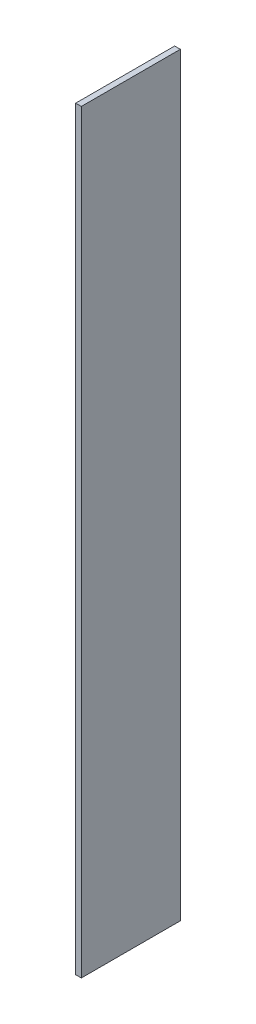
ISO-10303-21;
HEADER;
FILE_DESCRIPTION(('STEP AP214'),'2;1');
FILE_NAME('part.step','',(''),(''),'','','');
FILE_SCHEMA(('AUTOMOTIVE_DESIGN { 1 0 10303 214 1 1 1 1 }'));
ENDSEC;
DATA;
#1=APPLICATION_CONTEXT('core data for automotive mechanical design processes');
#2=APPLICATION_PROTOCOL_DEFINITION('international standard','automotive_design',2000,#1);
#3=PRODUCT_CONTEXT('',#1,'mechanical');
#4=PRODUCT('Part','Part','',(#3));
#5=PRODUCT_RELATED_PRODUCT_CATEGORY('part','',(#4));
#6=PRODUCT_DEFINITION_FORMATION('','',#4);
#7=PRODUCT_DEFINITION_CONTEXT('part definition',#1,'design');
#8=PRODUCT_DEFINITION('design','',#6,#7);
#9=PRODUCT_DEFINITION_SHAPE('','',#8);
#10=(LENGTH_UNIT() NAMED_UNIT(*) SI_UNIT(.MILLI.,.METRE.));
#11=(NAMED_UNIT(*) PLANE_ANGLE_UNIT() SI_UNIT($,.RADIAN.));
#12=(NAMED_UNIT(*) SI_UNIT($,.STERADIAN.) SOLID_ANGLE_UNIT());
#13=UNCERTAINTY_MEASURE_WITH_UNIT(LENGTH_MEASURE(1.E-05),#10,'distance_accuracy_value','');
#14=(GEOMETRIC_REPRESENTATION_CONTEXT(3) GLOBAL_UNCERTAINTY_ASSIGNED_CONTEXT((#13)) GLOBAL_UNIT_ASSIGNED_CONTEXT((#10,
#11,#12)) REPRESENTATION_CONTEXT('',''));
#15=CARTESIAN_POINT('',(0.,0.,0.));
#16=DIRECTION('',(0.,0.,1.));
#17=DIRECTION('',(1.,0.,0.));
#18=AXIS2_PLACEMENT_3D('',#15,#16,#17);
#19=CARTESIAN_POINT('',(1.00000000000002,533.,-10.1481942013614));
#20=DIRECTION('',(1.,0.,0.));
#21=DIRECTION('',(0.,0.,-1.));
#22=AXIS2_PLACEMENT_3D('',#19,#20,#21);
#23=PLANE('',#22);
#24=DIRECTION('',(0.,0.,1.));
#25=VECTOR('',#24,1.);
#26=CARTESIAN_POINT('',(1.00000000000002,0.,-10.1481942013614));
#27=LINE('',#26,#25);
#28=CARTESIAN_POINT('',(1.00000000000002,0.,-10.1481942013614));
#29=VERTEX_POINT('',#28);
#30=CARTESIAN_POINT('',(1.00000000000002,0.,59.754084156297));
#31=VERTEX_POINT('',#30);
#32=EDGE_CURVE('E98',#29,#31,#27,.T.);
#33=ORIENTED_EDGE('',*,*,#32,.T.);
#34=DIRECTION('',(0.,-1.,0.));
#35=VECTOR('',#34,1.);
#36=CARTESIAN_POINT('',(1.00000000000002,533.,59.754084156297));
#37=LINE('',#36,#35);
#38=CARTESIAN_POINT('',(1.00000000000002,533.,59.754084156297));
#39=VERTEX_POINT('',#38);
#40=EDGE_CURVE('E11',#39,#31,#37,.T.);
#41=ORIENTED_EDGE('',*,*,#40,.F.);
#42=DIRECTION('',(0.,0.,1.));
#43=VECTOR('',#42,1.);
#44=CARTESIAN_POINT('',(1.00000000000002,533.,-10.1481942013614));
#45=LINE('',#44,#43);
#46=CARTESIAN_POINT('',(1.00000000000002,533.,-10.1481942013614));
#47=VERTEX_POINT('',#46);
#48=EDGE_CURVE('E86',#47,#39,#45,.T.);
#49=ORIENTED_EDGE('',*,*,#48,.F.);
#50=DIRECTION('',(0.,-1.,0.));
#51=VECTOR('',#50,1.);
#52=CARTESIAN_POINT('',(1.00000000000002,533.,-10.1481942013614));
#53=LINE('',#52,#51);
#54=EDGE_CURVE('E94',#47,#29,#53,.T.);
#55=ORIENTED_EDGE('',*,*,#54,.T.);
#56=EDGE_LOOP('',(#33,#41,#49,#55));
#57=FACE_BOUND('',#56,.T.);
#58=ADVANCED_FACE('F35',(#57),#23,.F.);
#59=CARTESIAN_POINT('',(1.00000000000002,533.,59.754084156297));
#60=DIRECTION('',(0.,0.,-1.));
#61=DIRECTION('',(-1.,0.,0.));
#62=AXIS2_PLACEMENT_3D('',#59,#60,#61);
#63=PLANE('',#62);
#64=DIRECTION('',(1.,0.,0.));
#65=VECTOR('',#64,1.);
#66=CARTESIAN_POINT('',(1.00000000000002,0.,59.754084156297));
#67=LINE('',#66,#65);
#68=CARTESIAN_POINT('',(5.00000000000002,0.,59.754084156297));
#69=VERTEX_POINT('',#68);
#70=EDGE_CURVE('E90',#31,#69,#67,.T.);
#71=ORIENTED_EDGE('',*,*,#70,.T.);
#72=DIRECTION('',(0.,-1.,0.));
#73=VECTOR('',#72,1.);
#74=CARTESIAN_POINT('',(5.00000000000002,533.,59.754084156297));
#75=LINE('',#74,#73);
#76=CARTESIAN_POINT('',(5.00000000000002,533.,59.754084156297));
#77=VERTEX_POINT('',#76);
#78=EDGE_CURVE('E43',#77,#69,#75,.T.);
#79=ORIENTED_EDGE('',*,*,#78,.F.);
#80=DIRECTION('',(1.,0.,0.));
#81=VECTOR('',#80,1.);
#82=CARTESIAN_POINT('',(1.00000000000002,533.,59.754084156297));
#83=LINE('',#82,#81);
#84=EDGE_CURVE('E81',#39,#77,#83,.T.);
#85=ORIENTED_EDGE('',*,*,#84,.F.);
#86=ORIENTED_EDGE('',*,*,#40,.T.);
#87=EDGE_LOOP('',(#71,#79,#85,#86));
#88=FACE_BOUND('',#87,.T.);
#89=ADVANCED_FACE('F89',(#88),#63,.F.);
#90=CARTESIAN_POINT('',(5.00000000000002,533.,-10.1481942013614));
#91=DIRECTION('',(-1.,0.,0.));
#92=DIRECTION('',(0.,0.,1.));
#93=AXIS2_PLACEMENT_3D('',#90,#91,#92);
#94=PLANE('',#93);
#95=DIRECTION('',(0.,0.,-1.));
#96=VECTOR('',#95,1.);
#97=CARTESIAN_POINT('',(5.00000000000002,0.,-10.1481942013614));
#98=LINE('',#97,#96);
#99=CARTESIAN_POINT('',(5.00000000000002,0.,-10.1481942013614));
#100=VERTEX_POINT('',#99);
#101=EDGE_CURVE('E68',#69,#100,#98,.T.);
#102=ORIENTED_EDGE('',*,*,#101,.T.);
#103=DIRECTION('',(0.,-1.,0.));
#104=VECTOR('',#103,1.);
#105=CARTESIAN_POINT('',(5.00000000000002,533.,-10.1481942013614));
#106=LINE('',#105,#104);
#107=CARTESIAN_POINT('',(5.00000000000002,533.,-10.1481942013614));
#108=VERTEX_POINT('',#107);
#109=EDGE_CURVE('E91',#108,#100,#106,.T.);
#110=ORIENTED_EDGE('',*,*,#109,.F.);
#111=DIRECTION('',(0.,0.,-1.));
#112=VECTOR('',#111,1.);
#113=CARTESIAN_POINT('',(5.00000000000002,533.,-10.1481942013614));
#114=LINE('',#113,#112);
#115=EDGE_CURVE('E84',#77,#108,#114,.T.);
#116=ORIENTED_EDGE('',*,*,#115,.F.);
#117=ORIENTED_EDGE('',*,*,#78,.T.);
#118=EDGE_LOOP('',(#102,#110,#116,#117));
#119=FACE_BOUND('',#118,.T.);
#120=ADVANCED_FACE('F92',(#119),#94,.F.);
#121=CARTESIAN_POINT('',(1.00000000000002,533.,-10.1481942013614));
#122=DIRECTION('',(0.,0.,1.));
#123=DIRECTION('',(1.,0.,0.));
#124=AXIS2_PLACEMENT_3D('',#121,#122,#123);
#125=PLANE('',#124);
#126=DIRECTION('',(-1.,0.,0.));
#127=VECTOR('',#126,1.);
#128=CARTESIAN_POINT('',(1.00000000000002,0.,-10.1481942013614));
#129=LINE('',#128,#127);
#130=EDGE_CURVE('E74',#100,#29,#129,.T.);
#131=ORIENTED_EDGE('',*,*,#130,.T.);
#132=ORIENTED_EDGE('',*,*,#54,.F.);
#133=DIRECTION('',(-1.,0.,0.));
#134=VECTOR('',#133,1.);
#135=CARTESIAN_POINT('',(1.00000000000002,533.,-10.1481942013614));
#136=LINE('',#135,#134);
#137=EDGE_CURVE('E51',#108,#47,#136,.T.);
#138=ORIENTED_EDGE('',*,*,#137,.F.);
#139=ORIENTED_EDGE('',*,*,#109,.T.);
#140=EDGE_LOOP('',(#131,#132,#138,#139));
#141=FACE_BOUND('',#140,.T.);
#142=ADVANCED_FACE('F105',(#141),#125,.F.);
#143=CARTESIAN_POINT('',(1.00000000000002,533.,59.754084156297));
#144=DIRECTION('',(0.,1.,0.));
#145=DIRECTION('',(0.,0.,1.));
#146=AXIS2_PLACEMENT_3D('',#143,#144,#145);
#147=PLANE('',#146);
#148=ORIENTED_EDGE('',*,*,#48,.T.);
#149=ORIENTED_EDGE('',*,*,#84,.T.);
#150=ORIENTED_EDGE('',*,*,#115,.T.);
#151=ORIENTED_EDGE('',*,*,#137,.T.);
#152=EDGE_LOOP('',(#148,#149,#150,#151));
#153=FACE_BOUND('',#152,.T.);
#154=ADVANCED_FACE('F82',(#153),#147,.T.);
#155=CARTESIAN_POINT('',(1.00000000000002,0.,59.754084156297));
#156=DIRECTION('',(0.,1.,0.));
#157=DIRECTION('',(0.,0.,1.));
#158=AXIS2_PLACEMENT_3D('',#155,#156,#157);
#159=PLANE('',#158);
#160=ORIENTED_EDGE('',*,*,#32,.F.);
#161=ORIENTED_EDGE('',*,*,#130,.F.);
#162=ORIENTED_EDGE('',*,*,#101,.F.);
#163=ORIENTED_EDGE('',*,*,#70,.F.);
#164=EDGE_LOOP('',(#160,#161,#162,#163));
#165=FACE_BOUND('',#164,.T.);
#166=ADVANCED_FACE('F108',(#165),#159,.F.);
#167=CLOSED_SHELL('',(#58,#89,#120,#142,#154,#166));
#168=MANIFOLD_SOLID_BREP('B2',#167);
#169=ADVANCED_BREP_SHAPE_REPRESENTATION('',(#18,#168),#14);
#170=SHAPE_DEFINITION_REPRESENTATION(#9,#169);
ENDSEC;
END-ISO-10303-21;
